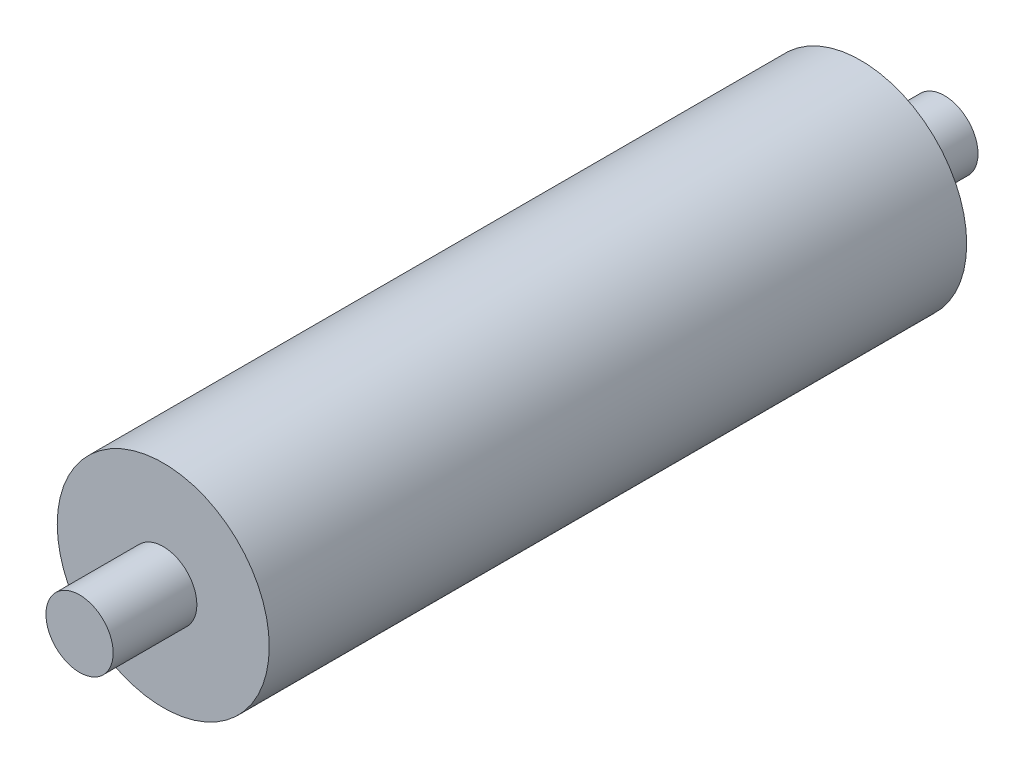
ISO-10303-21;
HEADER;
FILE_DESCRIPTION(('STEP AP214'),'2;1');
FILE_NAME('part.step','',(''),(''),'','','');
FILE_SCHEMA(('AUTOMOTIVE_DESIGN { 1 0 10303 214 1 1 1 1 }'));
ENDSEC;
DATA;
#1=APPLICATION_CONTEXT('core data for automotive mechanical design processes');
#2=APPLICATION_PROTOCOL_DEFINITION('international standard','automotive_design',2000,#1);
#3=PRODUCT_CONTEXT('',#1,'mechanical');
#4=PRODUCT('Part','Part','',(#3));
#5=PRODUCT_RELATED_PRODUCT_CATEGORY('part','',(#4));
#6=PRODUCT_DEFINITION_FORMATION('','',#4);
#7=PRODUCT_DEFINITION_CONTEXT('part definition',#1,'design');
#8=PRODUCT_DEFINITION('design','',#6,#7);
#9=PRODUCT_DEFINITION_SHAPE('','',#8);
#10=(LENGTH_UNIT() NAMED_UNIT(*) SI_UNIT(.MILLI.,.METRE.));
#11=(NAMED_UNIT(*) PLANE_ANGLE_UNIT() SI_UNIT($,.RADIAN.));
#12=(NAMED_UNIT(*) SI_UNIT($,.STERADIAN.) SOLID_ANGLE_UNIT());
#13=UNCERTAINTY_MEASURE_WITH_UNIT(LENGTH_MEASURE(1.E-05),#10,'distance_accuracy_value','');
#14=(GEOMETRIC_REPRESENTATION_CONTEXT(3) GLOBAL_UNCERTAINTY_ASSIGNED_CONTEXT((#13)) GLOBAL_UNIT_ASSIGNED_CONTEXT((#10,
#11,#12)) REPRESENTATION_CONTEXT('',''));
#15=CARTESIAN_POINT('',(0.,0.,0.));
#16=DIRECTION('',(0.,0.,1.));
#17=DIRECTION('',(1.,0.,0.));
#18=AXIS2_PLACEMENT_3D('',#15,#16,#17);
#19=CARTESIAN_POINT('',(0.,0.,-125.));
#20=DIRECTION('',(0.,0.,1.));
#21=DIRECTION('',(1.,0.,0.));
#22=AXIS2_PLACEMENT_3D('',#19,#20,#21);
#23=CYLINDRICAL_SURFACE('',#22,19.);
#24=CARTESIAN_POINT('',(0.,0.,-125.));
#25=DIRECTION('',(0.,0.,1.));
#26=DIRECTION('',(1.,0.,0.));
#27=AXIS2_PLACEMENT_3D('',#24,#25,#26);
#28=CIRCLE('',#27,19.);
#29=CARTESIAN_POINT('',(19.,0.,-125.));
#30=VERTEX_POINT('',#29);
#31=EDGE_CURVE('E99',#30,#30,#28,.T.);
#32=ORIENTED_EDGE('',*,*,#31,.T.);
#33=EDGE_LOOP('',(#32));
#34=FACE_BOUND('',#33,.T.);
#35=CARTESIAN_POINT('',(0.,0.,0.));
#36=DIRECTION('',(0.,0.,1.));
#37=DIRECTION('',(1.,0.,0.));
#38=AXIS2_PLACEMENT_3D('',#35,#36,#37);
#39=CIRCLE('',#38,19.);
#40=CARTESIAN_POINT('',(19.,0.,0.));
#41=VERTEX_POINT('',#40);
#42=EDGE_CURVE('E98',#41,#41,#39,.T.);
#43=ORIENTED_EDGE('',*,*,#42,.F.);
#44=EDGE_LOOP('',(#43));
#45=FACE_BOUND('',#44,.T.);
#46=ADVANCED_FACE('F39',(#34,#45),#23,.T.);
#47=CARTESIAN_POINT('',(0.,0.,-125.));
#48=DIRECTION('',(0.,0.,1.));
#49=DIRECTION('',(1.,0.,0.));
#50=AXIS2_PLACEMENT_3D('',#47,#48,#49);
#51=PLANE('',#50);
#52=CARTESIAN_POINT('',(0.,0.,-125.));
#53=DIRECTION('',(0.,0.,1.));
#54=DIRECTION('',(1.,0.,0.));
#55=AXIS2_PLACEMENT_3D('',#52,#53,#54);
#56=CIRCLE('',#55,6.025);
#57=CARTESIAN_POINT('',(6.025,0.,-125.));
#58=VERTEX_POINT('',#57);
#59=EDGE_CURVE('E90',#58,#58,#56,.T.);
#60=ORIENTED_EDGE('',*,*,#59,.T.);
#61=EDGE_LOOP('',(#60));
#62=FACE_BOUND('',#61,.T.);
#63=ORIENTED_EDGE('',*,*,#31,.F.);
#64=EDGE_LOOP('',(#63));
#65=FACE_BOUND('',#64,.T.);
#66=ADVANCED_FACE('F325',(#62,#65),#51,.F.);
#67=CARTESIAN_POINT('',(0.,0.,0.));
#68=DIRECTION('',(0.,0.,1.));
#69=DIRECTION('',(1.,0.,0.));
#70=AXIS2_PLACEMENT_3D('',#67,#68,#69);
#71=PLANE('',#70);
#72=CARTESIAN_POINT('',(0.,0.,0.));
#73=DIRECTION('',(0.,0.,1.));
#74=DIRECTION('',(1.,0.,0.));
#75=AXIS2_PLACEMENT_3D('',#72,#73,#74);
#76=CIRCLE('',#75,6.025);
#77=CARTESIAN_POINT('',(6.025,0.,0.));
#78=VERTEX_POINT('',#77);
#79=EDGE_CURVE('E94',#78,#78,#76,.T.);
#80=ORIENTED_EDGE('',*,*,#79,.F.);
#81=EDGE_LOOP('',(#80));
#82=FACE_BOUND('',#81,.T.);
#83=ORIENTED_EDGE('',*,*,#42,.T.);
#84=EDGE_LOOP('',(#83));
#85=FACE_BOUND('',#84,.T.);
#86=ADVANCED_FACE('F195',(#82,#85),#71,.T.);
#87=CARTESIAN_POINT('',(0.,0.,15.));
#88=DIRECTION('',(0.,0.,1.));
#89=DIRECTION('',(1.,0.,0.));
#90=AXIS2_PLACEMENT_3D('',#87,#88,#89);
#91=PLANE('',#90);
#92=CARTESIAN_POINT('',(0.,0.,15.));
#93=DIRECTION('',(0.,0.,1.));
#94=DIRECTION('',(1.,0.,0.));
#95=AXIS2_PLACEMENT_3D('',#92,#93,#94);
#96=CIRCLE('',#95,6.025);
#97=CARTESIAN_POINT('',(6.025,0.,15.));
#98=VERTEX_POINT('',#97);
#99=EDGE_CURVE('E77',#98,#98,#96,.T.);
#100=ORIENTED_EDGE('',*,*,#99,.T.);
#101=EDGE_LOOP('',(#100));
#102=FACE_BOUND('',#101,.T.);
#103=ADVANCED_FACE('F191',(#102),#91,.T.);
#104=CARTESIAN_POINT('',(0.,0.,-140.));
#105=DIRECTION('',(0.,0.,1.));
#106=DIRECTION('',(1.,0.,0.));
#107=AXIS2_PLACEMENT_3D('',#104,#105,#106);
#108=CYLINDRICAL_SURFACE('',#107,6.025);
#109=ORIENTED_EDGE('',*,*,#79,.T.);
#110=EDGE_LOOP('',(#109));
#111=FACE_BOUND('',#110,.T.);
#112=ORIENTED_EDGE('',*,*,#99,.F.);
#113=EDGE_LOOP('',(#112));
#114=FACE_BOUND('',#113,.T.);
#115=ADVANCED_FACE('F194',(#111,#114),#108,.T.);
#116=CARTESIAN_POINT('',(0.,0.,-140.));
#117=DIRECTION('',(0.,0.,1.));
#118=DIRECTION('',(1.,0.,0.));
#119=AXIS2_PLACEMENT_3D('',#116,#117,#118);
#120=CIRCLE('',#119,6.025);
#121=CARTESIAN_POINT('',(6.025,0.,-140.));
#122=VERTEX_POINT('',#121);
#123=EDGE_CURVE('E81',#122,#122,#120,.T.);
#124=ORIENTED_EDGE('',*,*,#123,.T.);
#125=EDGE_LOOP('',(#124));
#126=FACE_BOUND('',#125,.T.);
#127=ORIENTED_EDGE('',*,*,#59,.F.);
#128=EDGE_LOOP('',(#127));
#129=FACE_BOUND('',#128,.T.);
#130=ADVANCED_FACE('F199',(#126,#129),#108,.T.);
#131=CARTESIAN_POINT('',(0.,0.,-140.));
#132=DIRECTION('',(0.,0.,1.));
#133=DIRECTION('',(1.,0.,0.));
#134=AXIS2_PLACEMENT_3D('',#131,#132,#133);
#135=PLANE('',#134);
#136=ORIENTED_EDGE('',*,*,#123,.F.);
#137=EDGE_LOOP('',(#136));
#138=FACE_BOUND('',#137,.T.);
#139=ADVANCED_FACE('F197',(#138),#135,.F.);
#140=CLOSED_SHELL('',(#46,#66,#86,#103,#115,#130,#139));
#141=CARTESIAN_POINT('',(0.,0.,-27.5));
#142=DIRECTION('',(0.,0.,1.));
#143=DIRECTION('',(1.,0.,0.));
#144=AXIS2_PLACEMENT_3D('',#141,#142,#143);
#145=PLANE('',#144);
#146=CARTESIAN_POINT('',(0.,0.,-27.5));
#147=DIRECTION('',(0.,0.,1.));
#148=DIRECTION('',(1.,0.,0.));
#149=AXIS2_PLACEMENT_3D('',#146,#147,#148);
#150=CIRCLE('',#149,6.025);
#151=CARTESIAN_POINT('',(6.025,0.,-27.5));
#152=VERTEX_POINT('',#151);
#153=EDGE_CURVE('E48',#152,#152,#150,.F.);
#154=ORIENTED_EDGE('',*,*,#153,.T.);
#155=EDGE_LOOP('',(#154));
#156=FACE_BOUND('',#155,.T.);
#157=CARTESIAN_POINT('',(0.,0.,-27.5));
#158=DIRECTION('',(0.,0.,1.));
#159=DIRECTION('',(1.,0.,0.));
#160=AXIS2_PLACEMENT_3D('',#157,#158,#159);
#161=CIRCLE('',#160,14.);
#162=CARTESIAN_POINT('',(14.,0.,-27.5));
#163=VERTEX_POINT('',#162);
#164=EDGE_CURVE('E57',#163,#163,#161,.F.);
#165=ORIENTED_EDGE('',*,*,#164,.F.);
#166=EDGE_LOOP('',(#165));
#167=FACE_BOUND('',#166,.T.);
#168=ADVANCED_FACE('F216',(#156,#167),#145,.T.);
#169=CARTESIAN_POINT('',(0.,0.,-125.));
#170=DIRECTION('',(0.,0.,1.));
#171=DIRECTION('',(1.,0.,0.));
#172=AXIS2_PLACEMENT_3D('',#169,#170,#171);
#173=CYLINDRICAL_SURFACE('',#172,14.);
#174=ORIENTED_EDGE('',*,*,#164,.T.);
#175=EDGE_LOOP('',(#174));
#176=FACE_BOUND('',#175,.T.);
#177=CARTESIAN_POINT('',(0.,0.,-7.50000000000001));
#178=DIRECTION('',(0.,0.,1.));
#179=DIRECTION('',(1.,0.,0.));
#180=AXIS2_PLACEMENT_3D('',#177,#178,#179);
#181=CIRCLE('',#180,14.);
#182=CARTESIAN_POINT('',(14.,0.,-7.50000000000001));
#183=VERTEX_POINT('',#182);
#184=EDGE_CURVE('E103',#183,#183,#181,.F.);
#185=ORIENTED_EDGE('',*,*,#184,.F.);
#186=EDGE_LOOP('',(#185));
#187=FACE_BOUND('',#186,.T.);
#188=ADVANCED_FACE('F156',(#176,#187),#173,.F.);
#189=CARTESIAN_POINT('',(0.,0.,-7.5));
#190=DIRECTION('',(0.,0.,1.));
#191=DIRECTION('',(1.,0.,0.));
#192=AXIS2_PLACEMENT_3D('',#189,#190,#191);
#193=PLANE('',#192);
#194=CARTESIAN_POINT('',(0.,0.,-7.50000000000001));
#195=DIRECTION('',(0.,0.,1.));
#196=DIRECTION('',(1.,0.,0.));
#197=AXIS2_PLACEMENT_3D('',#194,#195,#196);
#198=CIRCLE('',#197,6.025);
#199=CARTESIAN_POINT('',(6.025,0.,-7.50000000000001));
#200=VERTEX_POINT('',#199);
#201=EDGE_CURVE('E86',#200,#200,#198,.T.);
#202=ORIENTED_EDGE('',*,*,#201,.T.);
#203=EDGE_LOOP('',(#202));
#204=FACE_BOUND('',#203,.T.);
#205=ORIENTED_EDGE('',*,*,#184,.T.);
#206=EDGE_LOOP('',(#205));
#207=FACE_BOUND('',#206,.T.);
#208=ADVANCED_FACE('F206',(#204,#207),#193,.F.);
#209=ORIENTED_EDGE('',*,*,#153,.F.);
#210=EDGE_LOOP('',(#209));
#211=FACE_BOUND('',#210,.T.);
#212=ORIENTED_EDGE('',*,*,#201,.F.);
#213=EDGE_LOOP('',(#212));
#214=FACE_BOUND('',#213,.T.);
#215=ADVANCED_FACE('F208',(#211,#214),#108,.T.);
#216=CLOSED_SHELL('',(#168,#188,#208,#215));
#217=CARTESIAN_POINT('',(0.,0.,-87.5));
#218=DIRECTION('',(0.,0.,1.));
#219=DIRECTION('',(1.,0.,0.));
#220=AXIS2_PLACEMENT_3D('',#217,#218,#219);
#221=PLANE('',#220);
#222=CARTESIAN_POINT('',(0.,0.,-87.5));
#223=DIRECTION('',(0.,0.,1.));
#224=DIRECTION('',(1.,0.,0.));
#225=AXIS2_PLACEMENT_3D('',#222,#223,#224);
#226=CIRCLE('',#225,6.025);
#227=CARTESIAN_POINT('',(6.025,0.,-87.5));
#228=VERTEX_POINT('',#227);
#229=EDGE_CURVE('E66',#228,#228,#226,.F.);
#230=ORIENTED_EDGE('',*,*,#229,.T.);
#231=EDGE_LOOP('',(#230));
#232=FACE_BOUND('',#231,.T.);
#233=CARTESIAN_POINT('',(0.,0.,-87.5));
#234=DIRECTION('',(0.,0.,1.));
#235=DIRECTION('',(1.,0.,0.));
#236=AXIS2_PLACEMENT_3D('',#233,#234,#235);
#237=CIRCLE('',#236,14.);
#238=CARTESIAN_POINT('',(14.,0.,-87.5));
#239=VERTEX_POINT('',#238);
#240=EDGE_CURVE('E58',#239,#239,#237,.F.);
#241=ORIENTED_EDGE('',*,*,#240,.F.);
#242=EDGE_LOOP('',(#241));
#243=FACE_BOUND('',#242,.T.);
#244=ADVANCED_FACE('F161',(#232,#243),#221,.T.);
#245=ORIENTED_EDGE('',*,*,#240,.T.);
#246=EDGE_LOOP('',(#245));
#247=FACE_BOUND('',#246,.T.);
#248=CARTESIAN_POINT('',(0.,0.,-67.5));
#249=DIRECTION('',(0.,0.,1.));
#250=DIRECTION('',(1.,0.,0.));
#251=AXIS2_PLACEMENT_3D('',#248,#249,#250);
#252=CIRCLE('',#251,14.);
#253=CARTESIAN_POINT('',(14.,0.,-67.5));
#254=VERTEX_POINT('',#253);
#255=EDGE_CURVE('E72',#254,#254,#252,.F.);
#256=ORIENTED_EDGE('',*,*,#255,.F.);
#257=EDGE_LOOP('',(#256));
#258=FACE_BOUND('',#257,.T.);
#259=ADVANCED_FACE('F145',(#247,#258),#173,.F.);
#260=CARTESIAN_POINT('',(0.,0.,-67.5));
#261=DIRECTION('',(0.,0.,1.));
#262=DIRECTION('',(1.,0.,0.));
#263=AXIS2_PLACEMENT_3D('',#260,#261,#262);
#264=PLANE('',#263);
#265=CARTESIAN_POINT('',(0.,0.,-67.5));
#266=DIRECTION('',(0.,0.,1.));
#267=DIRECTION('',(1.,0.,0.));
#268=AXIS2_PLACEMENT_3D('',#265,#266,#267);
#269=CIRCLE('',#268,6.025);
#270=CARTESIAN_POINT('',(6.025,0.,-67.5));
#271=VERTEX_POINT('',#270);
#272=EDGE_CURVE('E71',#271,#271,#269,.F.);
#273=ORIENTED_EDGE('',*,*,#272,.F.);
#274=EDGE_LOOP('',(#273));
#275=FACE_BOUND('',#274,.T.);
#276=ORIENTED_EDGE('',*,*,#255,.T.);
#277=EDGE_LOOP('',(#276));
#278=FACE_BOUND('',#277,.T.);
#279=ADVANCED_FACE('F160',(#275,#278),#264,.F.);
#280=ORIENTED_EDGE('',*,*,#229,.F.);
#281=EDGE_LOOP('',(#280));
#282=FACE_BOUND('',#281,.T.);
#283=ORIENTED_EDGE('',*,*,#272,.T.);
#284=EDGE_LOOP('',(#283));
#285=FACE_BOUND('',#284,.T.);
#286=ADVANCED_FACE('F153',(#282,#285),#108,.T.);
#287=CLOSED_SHELL('',(#244,#259,#279,#286));
#288=CARTESIAN_POINT('',(0.,0.,-57.5));
#289=DIRECTION('',(0.,0.,1.));
#290=DIRECTION('',(1.,0.,0.));
#291=AXIS2_PLACEMENT_3D('',#288,#289,#290);
#292=CIRCLE('',#291,14.);
#293=CARTESIAN_POINT('',(14.,0.,-57.5));
#294=VERTEX_POINT('',#293);
#295=EDGE_CURVE('E67',#294,#294,#292,.F.);
#296=ORIENTED_EDGE('',*,*,#295,.T.);
#297=EDGE_LOOP('',(#296));
#298=FACE_BOUND('',#297,.T.);
#299=CARTESIAN_POINT('',(0.,0.,-37.5));
#300=DIRECTION('',(0.,0.,1.));
#301=DIRECTION('',(1.,0.,0.));
#302=AXIS2_PLACEMENT_3D('',#299,#300,#301);
#303=CIRCLE('',#302,14.);
#304=CARTESIAN_POINT('',(14.,0.,-37.5));
#305=VERTEX_POINT('',#304);
#306=EDGE_CURVE('E11',#305,#305,#303,.F.);
#307=ORIENTED_EDGE('',*,*,#306,.F.);
#308=EDGE_LOOP('',(#307));
#309=FACE_BOUND('',#308,.T.);
#310=ADVANCED_FACE('F146',(#298,#309),#173,.F.);
#311=CARTESIAN_POINT('',(0.,0.,-57.5));
#312=DIRECTION('',(0.,0.,1.));
#313=DIRECTION('',(1.,0.,0.));
#314=AXIS2_PLACEMENT_3D('',#311,#312,#313);
#315=CIRCLE('',#314,6.025);
#316=CARTESIAN_POINT('',(6.025,0.,-57.5));
#317=VERTEX_POINT('',#316);
#318=EDGE_CURVE('E76',#317,#317,#315,.F.);
#319=ORIENTED_EDGE('',*,*,#318,.F.);
#320=EDGE_LOOP('',(#319));
#321=FACE_BOUND('',#320,.T.);
#322=CARTESIAN_POINT('',(0.,0.,-37.5));
#323=DIRECTION('',(0.,0.,1.));
#324=DIRECTION('',(1.,0.,0.));
#325=AXIS2_PLACEMENT_3D('',#322,#323,#324);
#326=CIRCLE('',#325,6.025);
#327=CARTESIAN_POINT('',(6.025,0.,-37.5));
#328=VERTEX_POINT('',#327);
#329=EDGE_CURVE('E42',#328,#328,#326,.F.);
#330=ORIENTED_EDGE('',*,*,#329,.T.);
#331=EDGE_LOOP('',(#330));
#332=FACE_BOUND('',#331,.T.);
#333=ADVANCED_FACE('F154',(#321,#332),#108,.T.);
#334=CARTESIAN_POINT('',(0.,0.,-57.5));
#335=DIRECTION('',(0.,0.,1.));
#336=DIRECTION('',(1.,0.,0.));
#337=AXIS2_PLACEMENT_3D('',#334,#335,#336);
#338=PLANE('',#337);
#339=ORIENTED_EDGE('',*,*,#318,.T.);
#340=EDGE_LOOP('',(#339));
#341=FACE_BOUND('',#340,.T.);
#342=ORIENTED_EDGE('',*,*,#295,.F.);
#343=EDGE_LOOP('',(#342));
#344=FACE_BOUND('',#343,.T.);
#345=ADVANCED_FACE('F185',(#341,#344),#338,.T.);
#346=CARTESIAN_POINT('',(0.,0.,-37.5));
#347=DIRECTION('',(0.,0.,1.));
#348=DIRECTION('',(1.,0.,0.));
#349=AXIS2_PLACEMENT_3D('',#346,#347,#348);
#350=PLANE('',#349);
#351=ORIENTED_EDGE('',*,*,#329,.F.);
#352=EDGE_LOOP('',(#351));
#353=FACE_BOUND('',#352,.T.);
#354=ORIENTED_EDGE('',*,*,#306,.T.);
#355=EDGE_LOOP('',(#354));
#356=FACE_BOUND('',#355,.T.);
#357=ADVANCED_FACE('F182',(#353,#356),#350,.F.);
#358=CLOSED_SHELL('',(#310,#333,#345,#357));
#359=CARTESIAN_POINT('',(0.,0.,-117.5));
#360=DIRECTION('',(0.,0.,-1.));
#361=DIRECTION('',(-1.,0.,0.));
#362=AXIS2_PLACEMENT_3D('',#359,#360,#361);
#363=CIRCLE('',#362,14.);
#364=CARTESIAN_POINT('',(-14.,0.,-117.5));
#365=VERTEX_POINT('',#364);
#366=EDGE_CURVE('E110',#365,#365,#363,.F.);
#367=ORIENTED_EDGE('',*,*,#366,.F.);
#368=EDGE_LOOP('',(#367));
#369=FACE_BOUND('',#368,.T.);
#370=CARTESIAN_POINT('',(0.,0.,-97.5));
#371=DIRECTION('',(0.,0.,1.));
#372=DIRECTION('',(1.,0.,0.));
#373=AXIS2_PLACEMENT_3D('',#370,#371,#372);
#374=CIRCLE('',#373,14.);
#375=CARTESIAN_POINT('',(14.,0.,-97.5));
#376=VERTEX_POINT('',#375);
#377=EDGE_CURVE('E54',#376,#376,#374,.F.);
#378=ORIENTED_EDGE('',*,*,#377,.F.);
#379=EDGE_LOOP('',(#378));
#380=FACE_BOUND('',#379,.T.);
#381=ADVANCED_FACE('F141',(#369,#380),#173,.F.);
#382=CARTESIAN_POINT('',(0.,0.,-117.5));
#383=DIRECTION('',(0.,0.,-1.));
#384=DIRECTION('',(-1.,0.,0.));
#385=AXIS2_PLACEMENT_3D('',#382,#383,#384);
#386=CIRCLE('',#385,6.025);
#387=CARTESIAN_POINT('',(-6.025,0.,-117.5));
#388=VERTEX_POINT('',#387);
#389=EDGE_CURVE('E85',#388,#388,#386,.T.);
#390=ORIENTED_EDGE('',*,*,#389,.F.);
#391=EDGE_LOOP('',(#390));
#392=FACE_BOUND('',#391,.T.);
#393=CARTESIAN_POINT('',(0.,0.,-97.5));
#394=DIRECTION('',(0.,0.,1.));
#395=DIRECTION('',(1.,0.,0.));
#396=AXIS2_PLACEMENT_3D('',#393,#394,#395);
#397=CIRCLE('',#396,6.025);
#398=CARTESIAN_POINT('',(6.025,0.,-97.5));
#399=VERTEX_POINT('',#398);
#400=EDGE_CURVE('E62',#399,#399,#397,.F.);
#401=ORIENTED_EDGE('',*,*,#400,.T.);
#402=EDGE_LOOP('',(#401));
#403=FACE_BOUND('',#402,.T.);
#404=ADVANCED_FACE('F130',(#392,#403),#108,.T.);
#405=CARTESIAN_POINT('',(0.,0.,-117.5));
#406=DIRECTION('',(0.,0.,-1.));
#407=DIRECTION('',(-1.,0.,0.));
#408=AXIS2_PLACEMENT_3D('',#405,#406,#407);
#409=PLANE('',#408);
#410=ORIENTED_EDGE('',*,*,#389,.T.);
#411=EDGE_LOOP('',(#410));
#412=FACE_BOUND('',#411,.T.);
#413=ORIENTED_EDGE('',*,*,#366,.T.);
#414=EDGE_LOOP('',(#413));
#415=FACE_BOUND('',#414,.T.);
#416=ADVANCED_FACE('F135',(#412,#415),#409,.F.);
#417=CARTESIAN_POINT('',(0.,0.,-97.5));
#418=DIRECTION('',(0.,0.,1.));
#419=DIRECTION('',(1.,0.,0.));
#420=AXIS2_PLACEMENT_3D('',#417,#418,#419);
#421=PLANE('',#420);
#422=ORIENTED_EDGE('',*,*,#400,.F.);
#423=EDGE_LOOP('',(#422));
#424=FACE_BOUND('',#423,.T.);
#425=ORIENTED_EDGE('',*,*,#377,.T.);
#426=EDGE_LOOP('',(#425));
#427=FACE_BOUND('',#426,.T.);
#428=ADVANCED_FACE('F132',(#424,#427),#421,.F.);
#429=CLOSED_SHELL('',(#381,#404,#416,#428));
#430=ORIENTED_CLOSED_SHELL('',*,#216,.T.);
#431=ORIENTED_CLOSED_SHELL('',*,#287,.T.);
#432=ORIENTED_CLOSED_SHELL('',*,#358,.T.);
#433=ORIENTED_CLOSED_SHELL('',*,#429,.T.);
#434=BREP_WITH_VOIDS('B2',#140,(#430,#431,#432,#433));
#435=ADVANCED_BREP_SHAPE_REPRESENTATION('',(#18,#434),#14);
#436=SHAPE_DEFINITION_REPRESENTATION(#9,#435);
ENDSEC;
END-ISO-10303-21;
